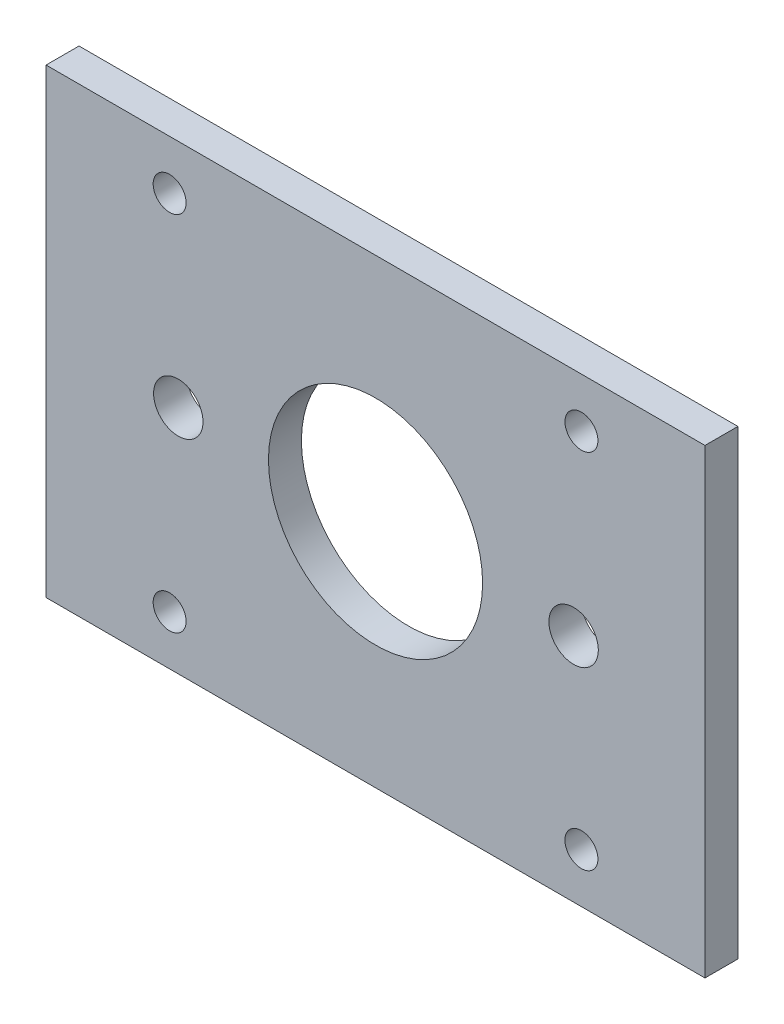
ISO-10303-21;
HEADER;
FILE_DESCRIPTION(('STEP AP214'),'2;1');
FILE_NAME('part.step','',(''),(''),'','','');
FILE_SCHEMA(('AUTOMOTIVE_DESIGN { 1 0 10303 214 1 1 1 1 }'));
ENDSEC;
DATA;
#1=APPLICATION_CONTEXT('core data for automotive mechanical design processes');
#2=APPLICATION_PROTOCOL_DEFINITION('international standard','automotive_design',2000,#1);
#3=PRODUCT_CONTEXT('',#1,'mechanical');
#4=PRODUCT('Part','Part','',(#3));
#5=PRODUCT_RELATED_PRODUCT_CATEGORY('part','',(#4));
#6=PRODUCT_DEFINITION_FORMATION('','',#4);
#7=PRODUCT_DEFINITION_CONTEXT('part definition',#1,'design');
#8=PRODUCT_DEFINITION('design','',#6,#7);
#9=PRODUCT_DEFINITION_SHAPE('','',#8);
#10=(LENGTH_UNIT() NAMED_UNIT(*) SI_UNIT(.MILLI.,.METRE.));
#11=(NAMED_UNIT(*) PLANE_ANGLE_UNIT() SI_UNIT($,.RADIAN.));
#12=(NAMED_UNIT(*) SI_UNIT($,.STERADIAN.) SOLID_ANGLE_UNIT());
#13=UNCERTAINTY_MEASURE_WITH_UNIT(LENGTH_MEASURE(1.E-05),#10,'distance_accuracy_value','');
#14=(GEOMETRIC_REPRESENTATION_CONTEXT(3) GLOBAL_UNCERTAINTY_ASSIGNED_CONTEXT((#13)) GLOBAL_UNIT_ASSIGNED_CONTEXT((#10,
#11,#12)) REPRESENTATION_CONTEXT('',''));
#15=CARTESIAN_POINT('',(0.,0.,0.));
#16=DIRECTION('',(0.,0.,1.));
#17=DIRECTION('',(1.,0.,0.));
#18=AXIS2_PLACEMENT_3D('',#15,#16,#17);
#19=CARTESIAN_POINT('',(0.,0.,4.));
#20=DIRECTION('',(0.,0.,1.));
#21=DIRECTION('',(1.,0.,0.));
#22=AXIS2_PLACEMENT_3D('',#19,#20,#21);
#23=PLANE('',#22);
#24=CARTESIAN_POINT('',(-23.9488588426717,6.99999999999923,4.));
#25=DIRECTION('',(0.,0.,1.));
#26=DIRECTION('',(1.,0.,0.));
#27=AXIS2_PLACEMENT_3D('',#24,#25,#26);
#28=CIRCLE('',#27,3.);
#29=CARTESIAN_POINT('',(-20.9488588426717,6.99999999999923,4.));
#30=VERTEX_POINT('',#29);
#31=EDGE_CURVE('E141',#30,#30,#28,.T.);
#32=ORIENTED_EDGE('',*,*,#31,.F.);
#33=EDGE_LOOP('',(#32));
#34=FACE_BOUND('',#33,.T.);
#35=CARTESIAN_POINT('',(24.0511411573283,6.99999999999923,4.));
#36=DIRECTION('',(0.,0.,1.));
#37=DIRECTION('',(1.,0.,0.));
#38=AXIS2_PLACEMENT_3D('',#35,#36,#37);
#39=CIRCLE('',#38,3.);
#40=CARTESIAN_POINT('',(27.0511411573283,6.99999999999923,4.));
#41=VERTEX_POINT('',#40);
#42=EDGE_CURVE('E130',#41,#41,#39,.T.);
#43=ORIENTED_EDGE('',*,*,#42,.F.);
#44=EDGE_LOOP('',(#43));
#45=FACE_BOUND('',#44,.T.);
#46=CARTESIAN_POINT('',(-25.0000000000322,28.9999999999994,4.));
#47=DIRECTION('',(0.,0.,1.));
#48=DIRECTION('',(1.,0.,0.));
#49=AXIS2_PLACEMENT_3D('',#46,#47,#48);
#50=CIRCLE('',#49,2.);
#51=CARTESIAN_POINT('',(-23.0000000000322,28.9999999999994,4.));
#52=VERTEX_POINT('',#51);
#53=EDGE_CURVE('E129',#52,#52,#50,.T.);
#54=ORIENTED_EDGE('',*,*,#53,.F.);
#55=EDGE_LOOP('',(#54));
#56=FACE_BOUND('',#55,.T.);
#57=CARTESIAN_POINT('',(-25.0000000000322,-15.0000000000006,4.));
#58=DIRECTION('',(0.,0.,1.));
#59=DIRECTION('',(1.,0.,0.));
#60=AXIS2_PLACEMENT_3D('',#57,#58,#59);
#61=CIRCLE('',#60,2.);
#62=CARTESIAN_POINT('',(-23.0000000000322,-15.0000000000006,4.));
#63=VERTEX_POINT('',#62);
#64=EDGE_CURVE('E120',#63,#63,#61,.T.);
#65=ORIENTED_EDGE('',*,*,#64,.F.);
#66=EDGE_LOOP('',(#65));
#67=FACE_BOUND('',#66,.T.);
#68=DIRECTION('',(0.,-1.,0.));
#69=VECTOR('',#68,1.);
#70=CARTESIAN_POINT('',(-40.0000000000322,-21.0000000000006,4.));
#71=LINE('',#70,#69);
#72=CARTESIAN_POINT('',(-40.0000000000322,35.0000000000011,4.));
#73=VERTEX_POINT('',#72);
#74=CARTESIAN_POINT('',(-40.0000000000322,-21.0000000000006,4.));
#75=VERTEX_POINT('',#74);
#76=EDGE_CURVE('E90',#73,#75,#71,.T.);
#77=ORIENTED_EDGE('',*,*,#76,.T.);
#78=DIRECTION('',(1.,0.,0.));
#79=VECTOR('',#78,1.);
#80=CARTESIAN_POINT('',(39.9999999999695,-21.0000000000006,4.));
#81=LINE('',#80,#79);
#82=CARTESIAN_POINT('',(39.9999999999695,-21.0000000000006,4.));
#83=VERTEX_POINT('',#82);
#84=EDGE_CURVE('E85',#75,#83,#81,.T.);
#85=ORIENTED_EDGE('',*,*,#84,.T.);
#86=DIRECTION('',(0.,1.,0.));
#87=VECTOR('',#86,1.);
#88=CARTESIAN_POINT('',(39.9999999999695,-21.0000000000006,4.));
#89=LINE('',#88,#87);
#90=CARTESIAN_POINT('',(39.9999999999695,35.0000000000011,4.));
#91=VERTEX_POINT('',#90);
#92=EDGE_CURVE('E88',#83,#91,#89,.T.);
#93=ORIENTED_EDGE('',*,*,#92,.T.);
#94=DIRECTION('',(-1.,0.,0.));
#95=VECTOR('',#94,1.);
#96=CARTESIAN_POINT('',(39.9999999999695,35.0000000000011,4.));
#97=LINE('',#96,#95);
#98=EDGE_CURVE('E54',#91,#73,#97,.T.);
#99=ORIENTED_EDGE('',*,*,#98,.T.);
#100=EDGE_LOOP('',(#77,#85,#93,#99));
#101=FACE_BOUND('',#100,.T.);
#102=CARTESIAN_POINT('',(-3.13568615517568E-11,7.00000000000024,4.));
#103=DIRECTION('',(0.,0.,1.));
#104=DIRECTION('',(1.,0.,0.));
#105=AXIS2_PLACEMENT_3D('',#102,#103,#104);
#106=CIRCLE('',#105,13.);
#107=CARTESIAN_POINT('',(12.9999999999686,7.00000000000024,4.));
#108=VERTEX_POINT('',#107);
#109=EDGE_CURVE('E108',#108,#108,#106,.T.);
#110=ORIENTED_EDGE('',*,*,#109,.F.);
#111=EDGE_LOOP('',(#110));
#112=FACE_BOUND('',#111,.T.);
#113=CARTESIAN_POINT('',(24.9999999999678,-15.0000000000006,4.));
#114=DIRECTION('',(0.,0.,1.));
#115=DIRECTION('',(1.,0.,0.));
#116=AXIS2_PLACEMENT_3D('',#113,#114,#115);
#117=CIRCLE('',#116,2.);
#118=CARTESIAN_POINT('',(26.9999999999678,-15.0000000000006,4.));
#119=VERTEX_POINT('',#118);
#120=EDGE_CURVE('E115',#119,#119,#117,.T.);
#121=ORIENTED_EDGE('',*,*,#120,.F.);
#122=EDGE_LOOP('',(#121));
#123=FACE_BOUND('',#122,.T.);
#124=CARTESIAN_POINT('',(24.9999999999678,28.9999999999994,4.));
#125=DIRECTION('',(0.,0.,1.));
#126=DIRECTION('',(1.,0.,0.));
#127=AXIS2_PLACEMENT_3D('',#124,#125,#126);
#128=CIRCLE('',#127,2.);
#129=CARTESIAN_POINT('',(26.9999999999678,28.9999999999994,4.));
#130=VERTEX_POINT('',#129);
#131=EDGE_CURVE('E45',#130,#130,#128,.T.);
#132=ORIENTED_EDGE('',*,*,#131,.F.);
#133=EDGE_LOOP('',(#132));
#134=FACE_BOUND('',#133,.T.);
#135=ADVANCED_FACE('F35',(#34,#45,#56,#67,#101,#112,#123,#134),#23,.T.);
#136=CARTESIAN_POINT('',(0.,0.,0.));
#137=DIRECTION('',(0.,0.,1.));
#138=DIRECTION('',(1.,0.,0.));
#139=AXIS2_PLACEMENT_3D('',#136,#137,#138);
#140=PLANE('',#139);
#141=CARTESIAN_POINT('',(-23.9488588426717,6.99999999999923,0.));
#142=DIRECTION('',(0.,0.,1.));
#143=DIRECTION('',(1.,0.,0.));
#144=AXIS2_PLACEMENT_3D('',#141,#142,#143);
#145=CIRCLE('',#144,3.);
#146=CARTESIAN_POINT('',(-20.9488588426717,6.99999999999923,0.));
#147=VERTEX_POINT('',#146);
#148=EDGE_CURVE('E39',#147,#147,#145,.T.);
#149=ORIENTED_EDGE('',*,*,#148,.T.);
#150=EDGE_LOOP('',(#149));
#151=FACE_BOUND('',#150,.T.);
#152=CARTESIAN_POINT('',(24.0511411573283,6.99999999999923,0.));
#153=DIRECTION('',(0.,0.,1.));
#154=DIRECTION('',(1.,0.,0.));
#155=AXIS2_PLACEMENT_3D('',#152,#153,#154);
#156=CIRCLE('',#155,3.);
#157=CARTESIAN_POINT('',(27.0511411573283,6.99999999999923,0.));
#158=VERTEX_POINT('',#157);
#159=EDGE_CURVE('E127',#158,#158,#156,.T.);
#160=ORIENTED_EDGE('',*,*,#159,.T.);
#161=EDGE_LOOP('',(#160));
#162=FACE_BOUND('',#161,.T.);
#163=CARTESIAN_POINT('',(-25.0000000000322,28.9999999999994,0.));
#164=DIRECTION('',(0.,0.,1.));
#165=DIRECTION('',(1.,0.,0.));
#166=AXIS2_PLACEMENT_3D('',#163,#164,#165);
#167=CIRCLE('',#166,2.);
#168=CARTESIAN_POINT('',(-23.0000000000322,28.9999999999994,0.));
#169=VERTEX_POINT('',#168);
#170=EDGE_CURVE('E134',#169,#169,#167,.T.);
#171=ORIENTED_EDGE('',*,*,#170,.T.);
#172=EDGE_LOOP('',(#171));
#173=FACE_BOUND('',#172,.T.);
#174=CARTESIAN_POINT('',(-25.0000000000322,-15.0000000000006,0.));
#175=DIRECTION('',(0.,0.,1.));
#176=DIRECTION('',(1.,0.,0.));
#177=AXIS2_PLACEMENT_3D('',#174,#175,#176);
#178=CIRCLE('',#177,2.);
#179=CARTESIAN_POINT('',(-23.0000000000322,-15.0000000000006,0.));
#180=VERTEX_POINT('',#179);
#181=EDGE_CURVE('E116',#180,#180,#178,.T.);
#182=ORIENTED_EDGE('',*,*,#181,.T.);
#183=EDGE_LOOP('',(#182));
#184=FACE_BOUND('',#183,.T.);
#185=DIRECTION('',(0.,-1.,0.));
#186=VECTOR('',#185,1.);
#187=CARTESIAN_POINT('',(-40.0000000000322,-21.0000000000006,0.));
#188=LINE('',#187,#186);
#189=CARTESIAN_POINT('',(-40.0000000000322,35.0000000000011,0.));
#190=VERTEX_POINT('',#189);
#191=CARTESIAN_POINT('',(-40.0000000000322,-21.0000000000006,0.));
#192=VERTEX_POINT('',#191);
#193=EDGE_CURVE('E105',#190,#192,#188,.T.);
#194=ORIENTED_EDGE('',*,*,#193,.F.);
#195=DIRECTION('',(-1.,0.,0.));
#196=VECTOR('',#195,1.);
#197=CARTESIAN_POINT('',(39.9999999999695,35.0000000000011,0.));
#198=LINE('',#197,#196);
#199=CARTESIAN_POINT('',(39.9999999999695,35.0000000000011,0.));
#200=VERTEX_POINT('',#199);
#201=EDGE_CURVE('E77',#200,#190,#198,.T.);
#202=ORIENTED_EDGE('',*,*,#201,.F.);
#203=DIRECTION('',(0.,1.,0.));
#204=VECTOR('',#203,1.);
#205=CARTESIAN_POINT('',(39.9999999999695,-21.0000000000006,0.));
#206=LINE('',#205,#204);
#207=CARTESIAN_POINT('',(39.9999999999695,-21.0000000000006,0.));
#208=VERTEX_POINT('',#207);
#209=EDGE_CURVE('E71',#208,#200,#206,.T.);
#210=ORIENTED_EDGE('',*,*,#209,.F.);
#211=DIRECTION('',(1.,0.,0.));
#212=VECTOR('',#211,1.);
#213=CARTESIAN_POINT('',(39.9999999999695,-21.0000000000006,0.));
#214=LINE('',#213,#212);
#215=EDGE_CURVE('E95',#192,#208,#214,.T.);
#216=ORIENTED_EDGE('',*,*,#215,.F.);
#217=EDGE_LOOP('',(#194,#202,#210,#216));
#218=FACE_BOUND('',#217,.T.);
#219=CARTESIAN_POINT('',(-3.13568615517568E-11,7.00000000000024,0.));
#220=DIRECTION('',(0.,0.,1.));
#221=DIRECTION('',(1.,0.,0.));
#222=AXIS2_PLACEMENT_3D('',#219,#220,#221);
#223=CIRCLE('',#222,13.);
#224=CARTESIAN_POINT('',(12.9999999999686,7.00000000000024,0.));
#225=VERTEX_POINT('',#224);
#226=EDGE_CURVE('E119',#225,#225,#223,.T.);
#227=ORIENTED_EDGE('',*,*,#226,.T.);
#228=EDGE_LOOP('',(#227));
#229=FACE_BOUND('',#228,.T.);
#230=CARTESIAN_POINT('',(24.9999999999678,-15.0000000000006,0.));
#231=DIRECTION('',(0.,0.,1.));
#232=DIRECTION('',(1.,0.,0.));
#233=AXIS2_PLACEMENT_3D('',#230,#231,#232);
#234=CIRCLE('',#233,2.);
#235=CARTESIAN_POINT('',(26.9999999999678,-15.0000000000006,0.));
#236=VERTEX_POINT('',#235);
#237=EDGE_CURVE('E123',#236,#236,#234,.T.);
#238=ORIENTED_EDGE('',*,*,#237,.T.);
#239=EDGE_LOOP('',(#238));
#240=FACE_BOUND('',#239,.T.);
#241=CARTESIAN_POINT('',(24.9999999999678,28.9999999999994,0.));
#242=DIRECTION('',(0.,0.,1.));
#243=DIRECTION('',(1.,0.,0.));
#244=AXIS2_PLACEMENT_3D('',#241,#242,#243);
#245=CIRCLE('',#244,2.);
#246=CARTESIAN_POINT('',(26.9999999999678,28.9999999999994,0.));
#247=VERTEX_POINT('',#246);
#248=EDGE_CURVE('E11',#247,#247,#245,.T.);
#249=ORIENTED_EDGE('',*,*,#248,.T.);
#250=EDGE_LOOP('',(#249));
#251=FACE_BOUND('',#250,.T.);
#252=ADVANCED_FACE('F153',(#151,#162,#173,#184,#218,#229,#240,#251),#140,.F.);
#253=CARTESIAN_POINT('',(-40.0000000000322,-21.0000000000006,4.));
#254=DIRECTION('',(1.,0.,0.));
#255=DIRECTION('',(0.,0.,-1.));
#256=AXIS2_PLACEMENT_3D('',#253,#254,#255);
#257=PLANE('',#256);
#258=ORIENTED_EDGE('',*,*,#193,.T.);
#259=DIRECTION('',(0.,0.,-1.));
#260=VECTOR('',#259,1.);
#261=CARTESIAN_POINT('',(-40.0000000000322,-21.0000000000006,4.));
#262=LINE('',#261,#260);
#263=EDGE_CURVE('E96',#75,#192,#262,.T.);
#264=ORIENTED_EDGE('',*,*,#263,.F.);
#265=ORIENTED_EDGE('',*,*,#76,.F.);
#266=DIRECTION('',(0.,0.,-1.));
#267=VECTOR('',#266,1.);
#268=CARTESIAN_POINT('',(-40.0000000000322,35.0000000000011,4.));
#269=LINE('',#268,#267);
#270=EDGE_CURVE('E101',#73,#190,#269,.T.);
#271=ORIENTED_EDGE('',*,*,#270,.T.);
#272=EDGE_LOOP('',(#258,#264,#265,#271));
#273=FACE_BOUND('',#272,.T.);
#274=ADVANCED_FACE('F177',(#273),#257,.F.);
#275=CARTESIAN_POINT('',(39.9999999999695,-21.0000000000006,4.));
#276=DIRECTION('',(0.,1.,0.));
#277=DIRECTION('',(0.,0.,1.));
#278=AXIS2_PLACEMENT_3D('',#275,#276,#277);
#279=PLANE('',#278);
#280=ORIENTED_EDGE('',*,*,#215,.T.);
#281=DIRECTION('',(0.,0.,-1.));
#282=VECTOR('',#281,1.);
#283=CARTESIAN_POINT('',(39.9999999999695,-21.0000000000006,4.));
#284=LINE('',#283,#282);
#285=EDGE_CURVE('E93',#83,#208,#284,.T.);
#286=ORIENTED_EDGE('',*,*,#285,.F.);
#287=ORIENTED_EDGE('',*,*,#84,.F.);
#288=ORIENTED_EDGE('',*,*,#263,.T.);
#289=EDGE_LOOP('',(#280,#286,#287,#288));
#290=FACE_BOUND('',#289,.T.);
#291=ADVANCED_FACE('F94',(#290),#279,.F.);
#292=CARTESIAN_POINT('',(39.9999999999695,-21.0000000000006,4.));
#293=DIRECTION('',(-1.,0.,0.));
#294=DIRECTION('',(0.,0.,1.));
#295=AXIS2_PLACEMENT_3D('',#292,#293,#294);
#296=PLANE('',#295);
#297=ORIENTED_EDGE('',*,*,#209,.T.);
#298=DIRECTION('',(0.,0.,-1.));
#299=VECTOR('',#298,1.);
#300=CARTESIAN_POINT('',(39.9999999999695,35.0000000000011,4.));
#301=LINE('',#300,#299);
#302=EDGE_CURVE('E97',#91,#200,#301,.T.);
#303=ORIENTED_EDGE('',*,*,#302,.F.);
#304=ORIENTED_EDGE('',*,*,#92,.F.);
#305=ORIENTED_EDGE('',*,*,#285,.T.);
#306=EDGE_LOOP('',(#297,#303,#304,#305));
#307=FACE_BOUND('',#306,.T.);
#308=ADVANCED_FACE('F99',(#307),#296,.F.);
#309=CARTESIAN_POINT('',(39.9999999999695,35.0000000000011,4.));
#310=DIRECTION('',(0.,-1.,0.));
#311=DIRECTION('',(0.,0.,-1.));
#312=AXIS2_PLACEMENT_3D('',#309,#310,#311);
#313=PLANE('',#312);
#314=ORIENTED_EDGE('',*,*,#201,.T.);
#315=ORIENTED_EDGE('',*,*,#270,.F.);
#316=ORIENTED_EDGE('',*,*,#98,.F.);
#317=ORIENTED_EDGE('',*,*,#302,.T.);
#318=EDGE_LOOP('',(#314,#315,#316,#317));
#319=FACE_BOUND('',#318,.T.);
#320=ADVANCED_FACE('F159',(#319),#313,.F.);
#321=CARTESIAN_POINT('',(-3.13568615517568E-11,7.00000000000024,4.));
#322=DIRECTION('',(0.,0.,-1.));
#323=DIRECTION('',(-1.,0.,0.));
#324=AXIS2_PLACEMENT_3D('',#321,#322,#323);
#325=CYLINDRICAL_SURFACE('',#324,13.);
#326=ORIENTED_EDGE('',*,*,#109,.T.);
#327=EDGE_LOOP('',(#326));
#328=FACE_BOUND('',#327,.T.);
#329=ORIENTED_EDGE('',*,*,#226,.F.);
#330=EDGE_LOOP('',(#329));
#331=FACE_BOUND('',#330,.T.);
#332=ADVANCED_FACE('F156',(#328,#331),#325,.F.);
#333=CARTESIAN_POINT('',(-25.0000000000322,-15.0000000000006,-96.));
#334=DIRECTION('',(0.,0.,1.));
#335=DIRECTION('',(1.,0.,0.));
#336=AXIS2_PLACEMENT_3D('',#333,#334,#335);
#337=CYLINDRICAL_SURFACE('',#336,2.);
#338=ORIENTED_EDGE('',*,*,#64,.T.);
#339=EDGE_LOOP('',(#338));
#340=FACE_BOUND('',#339,.T.);
#341=ORIENTED_EDGE('',*,*,#181,.F.);
#342=EDGE_LOOP('',(#341));
#343=FACE_BOUND('',#342,.T.);
#344=ADVANCED_FACE('F158',(#340,#343),#337,.F.);
#345=CARTESIAN_POINT('',(-25.0000000000322,28.9999999999994,-96.));
#346=DIRECTION('',(0.,0.,1.));
#347=DIRECTION('',(1.,0.,0.));
#348=AXIS2_PLACEMENT_3D('',#345,#346,#347);
#349=CYLINDRICAL_SURFACE('',#348,2.);
#350=ORIENTED_EDGE('',*,*,#53,.T.);
#351=EDGE_LOOP('',(#350));
#352=FACE_BOUND('',#351,.T.);
#353=ORIENTED_EDGE('',*,*,#170,.F.);
#354=EDGE_LOOP('',(#353));
#355=FACE_BOUND('',#354,.T.);
#356=ADVANCED_FACE('F166',(#352,#355),#349,.F.);
#357=CARTESIAN_POINT('',(24.9999999999678,-15.0000000000006,-96.));
#358=DIRECTION('',(0.,0.,1.));
#359=DIRECTION('',(1.,0.,0.));
#360=AXIS2_PLACEMENT_3D('',#357,#358,#359);
#361=CYLINDRICAL_SURFACE('',#360,2.);
#362=ORIENTED_EDGE('',*,*,#120,.T.);
#363=EDGE_LOOP('',(#362));
#364=FACE_BOUND('',#363,.T.);
#365=ORIENTED_EDGE('',*,*,#237,.F.);
#366=EDGE_LOOP('',(#365));
#367=FACE_BOUND('',#366,.T.);
#368=ADVANCED_FACE('F189',(#364,#367),#361,.F.);
#369=CARTESIAN_POINT('',(24.9999999999678,28.9999999999994,-96.));
#370=DIRECTION('',(0.,0.,1.));
#371=DIRECTION('',(1.,0.,0.));
#372=AXIS2_PLACEMENT_3D('',#369,#370,#371);
#373=CYLINDRICAL_SURFACE('',#372,2.);
#374=ORIENTED_EDGE('',*,*,#131,.T.);
#375=EDGE_LOOP('',(#374));
#376=FACE_BOUND('',#375,.T.);
#377=ORIENTED_EDGE('',*,*,#248,.F.);
#378=EDGE_LOOP('',(#377));
#379=FACE_BOUND('',#378,.T.);
#380=ADVANCED_FACE('F37',(#376,#379),#373,.F.);
#381=CARTESIAN_POINT('',(24.0511411573283,6.99999999999923,-46.));
#382=DIRECTION('',(0.,0.,1.));
#383=DIRECTION('',(1.,0.,0.));
#384=AXIS2_PLACEMENT_3D('',#381,#382,#383);
#385=CYLINDRICAL_SURFACE('',#384,3.);
#386=ORIENTED_EDGE('',*,*,#42,.T.);
#387=EDGE_LOOP('',(#386));
#388=FACE_BOUND('',#387,.T.);
#389=ORIENTED_EDGE('',*,*,#159,.F.);
#390=EDGE_LOOP('',(#389));
#391=FACE_BOUND('',#390,.T.);
#392=ADVANCED_FACE('F196',(#388,#391),#385,.F.);
#393=CARTESIAN_POINT('',(-23.9488588426717,6.99999999999923,-46.));
#394=DIRECTION('',(0.,0.,1.));
#395=DIRECTION('',(1.,0.,0.));
#396=AXIS2_PLACEMENT_3D('',#393,#394,#395);
#397=CYLINDRICAL_SURFACE('',#396,3.);
#398=ORIENTED_EDGE('',*,*,#31,.T.);
#399=EDGE_LOOP('',(#398));
#400=FACE_BOUND('',#399,.T.);
#401=ORIENTED_EDGE('',*,*,#148,.F.);
#402=EDGE_LOOP('',(#401));
#403=FACE_BOUND('',#402,.T.);
#404=ADVANCED_FACE('F215',(#400,#403),#397,.F.);
#405=CLOSED_SHELL('',(#135,#252,#274,#291,#308,#320,#332,#344,#356,#368,#380,#392,#404));
#406=MANIFOLD_SOLID_BREP('B2',#405);
#407=ADVANCED_BREP_SHAPE_REPRESENTATION('',(#18,#406),#14);
#408=SHAPE_DEFINITION_REPRESENTATION(#9,#407);
ENDSEC;
END-ISO-10303-21;
